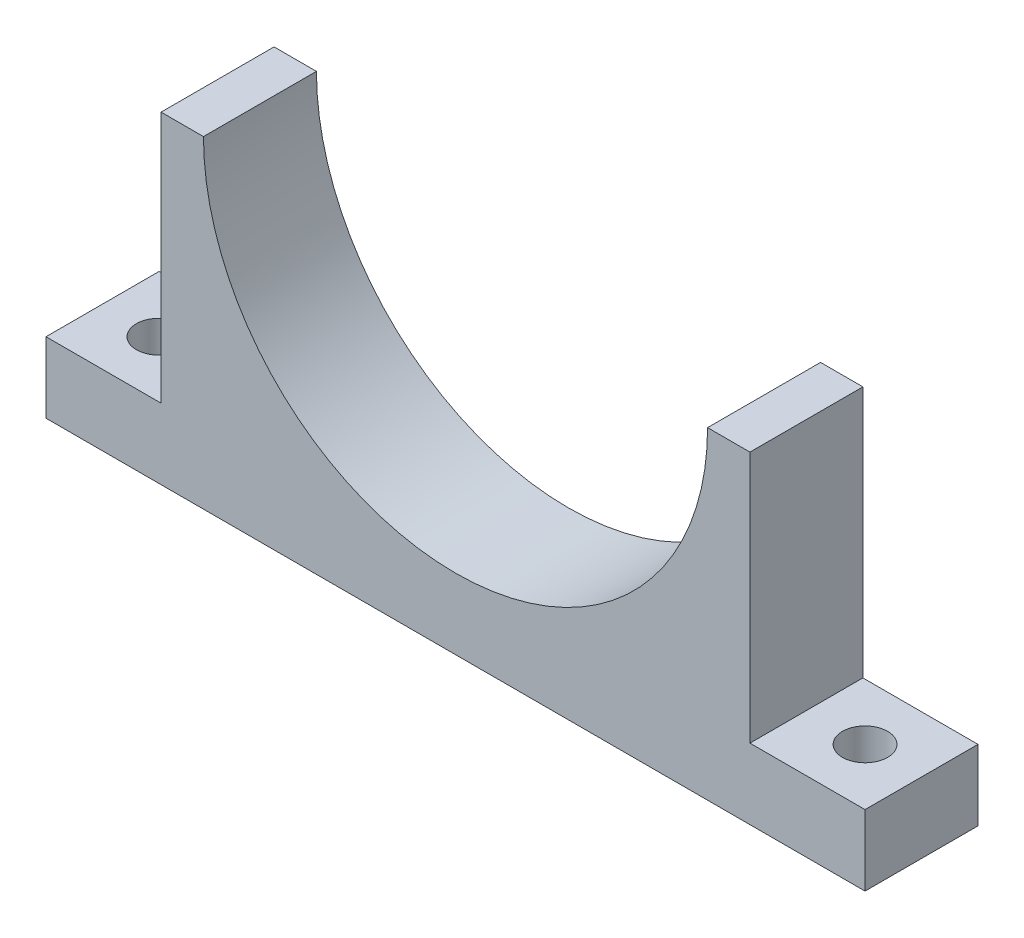
ISO-10303-21;
HEADER;
FILE_DESCRIPTION(('STEP AP214'),'2;1');
FILE_NAME('part.step','',(''),(''),'','','');
FILE_SCHEMA(('AUTOMOTIVE_DESIGN { 1 0 10303 214 1 1 1 1 }'));
ENDSEC;
DATA;
#1=APPLICATION_CONTEXT('core data for automotive mechanical design processes');
#2=APPLICATION_PROTOCOL_DEFINITION('international standard','automotive_design',2000,#1);
#3=PRODUCT_CONTEXT('',#1,'mechanical');
#4=PRODUCT('Part','Part','',(#3));
#5=PRODUCT_RELATED_PRODUCT_CATEGORY('part','',(#4));
#6=PRODUCT_DEFINITION_FORMATION('','',#4);
#7=PRODUCT_DEFINITION_CONTEXT('part definition',#1,'design');
#8=PRODUCT_DEFINITION('design','',#6,#7);
#9=PRODUCT_DEFINITION_SHAPE('','',#8);
#10=(LENGTH_UNIT() NAMED_UNIT(*) SI_UNIT(.MILLI.,.METRE.));
#11=(NAMED_UNIT(*) PLANE_ANGLE_UNIT() SI_UNIT($,.RADIAN.));
#12=(NAMED_UNIT(*) SI_UNIT($,.STERADIAN.) SOLID_ANGLE_UNIT());
#13=UNCERTAINTY_MEASURE_WITH_UNIT(LENGTH_MEASURE(1.E-05),#10,'distance_accuracy_value','');
#14=(GEOMETRIC_REPRESENTATION_CONTEXT(3) GLOBAL_UNCERTAINTY_ASSIGNED_CONTEXT((#13)) GLOBAL_UNIT_ASSIGNED_CONTEXT((#10,
#11,#12)) REPRESENTATION_CONTEXT('',''));
#15=CARTESIAN_POINT('',(0.,0.,0.));
#16=DIRECTION('',(0.,0.,1.));
#17=DIRECTION('',(1.,0.,0.));
#18=AXIS2_PLACEMENT_3D('',#15,#16,#17);
#19=CARTESIAN_POINT('',(0.,0.,8.));
#20=DIRECTION('',(0.,0.,-1.));
#21=DIRECTION('',(-1.,0.,0.));
#22=AXIS2_PLACEMENT_3D('',#19,#20,#21);
#23=CYLINDRICAL_SURFACE('',#22,17.85);
#24=CARTESIAN_POINT('',(0.,0.,0.));
#25=DIRECTION('',(0.,0.,-1.));
#26=DIRECTION('',(1.,0.,0.));
#27=AXIS2_PLACEMENT_3D('',#24,#25,#26);
#28=CIRCLE('',#27,17.85);
#29=CARTESIAN_POINT('',(17.85,0.,0.));
#30=VERTEX_POINT('',#29);
#31=CARTESIAN_POINT('',(-17.85,0.,0.));
#32=VERTEX_POINT('',#31);
#33=EDGE_CURVE('E142',#30,#32,#28,.T.);
#34=ORIENTED_EDGE('',*,*,#33,.T.);
#35=DIRECTION('',(0.,0.,-1.));
#36=VECTOR('',#35,1.);
#37=CARTESIAN_POINT('',(-17.85,0.,8.));
#38=LINE('',#37,#36);
#39=CARTESIAN_POINT('',(-17.85,0.,8.));
#40=VERTEX_POINT('',#39);
#41=EDGE_CURVE('E11',#40,#32,#38,.T.);
#42=ORIENTED_EDGE('',*,*,#41,.F.);
#43=CARTESIAN_POINT('',(0.,0.,8.));
#44=DIRECTION('',(0.,0.,-1.));
#45=DIRECTION('',(1.,0.,0.));
#46=AXIS2_PLACEMENT_3D('',#43,#44,#45);
#47=CIRCLE('',#46,17.85);
#48=CARTESIAN_POINT('',(17.85,0.,8.));
#49=VERTEX_POINT('',#48);
#50=EDGE_CURVE('E161',#49,#40,#47,.T.);
#51=ORIENTED_EDGE('',*,*,#50,.F.);
#52=DIRECTION('',(0.,0.,-1.));
#53=VECTOR('',#52,1.);
#54=CARTESIAN_POINT('',(17.85,0.,8.));
#55=LINE('',#54,#53);
#56=EDGE_CURVE('E138',#49,#30,#55,.T.);
#57=ORIENTED_EDGE('',*,*,#56,.T.);
#58=EDGE_LOOP('',(#34,#42,#51,#57));
#59=FACE_BOUND('',#58,.T.);
#60=ADVANCED_FACE('F33',(#59),#23,.F.);
#61=CARTESIAN_POINT('',(-17.85,0.,8.));
#62=DIRECTION('',(0.,-1.,0.));
#63=DIRECTION('',(1.,0.,0.));
#64=AXIS2_PLACEMENT_3D('',#61,#62,#63);
#65=PLANE('',#64);
#66=DIRECTION('',(-1.,0.,0.));
#67=VECTOR('',#66,1.);
#68=CARTESIAN_POINT('',(-17.85,0.,0.));
#69=LINE('',#68,#67);
#70=CARTESIAN_POINT('',(-20.85,0.,0.));
#71=VERTEX_POINT('',#70);
#72=EDGE_CURVE('E145',#32,#71,#69,.T.);
#73=ORIENTED_EDGE('',*,*,#72,.T.);
#74=DIRECTION('',(0.,0.,-1.));
#75=VECTOR('',#74,1.);
#76=CARTESIAN_POINT('',(-20.85,0.,8.));
#77=LINE('',#76,#75);
#78=CARTESIAN_POINT('',(-20.85,0.,8.));
#79=VERTEX_POINT('',#78);
#80=EDGE_CURVE('E42',#79,#71,#77,.T.);
#81=ORIENTED_EDGE('',*,*,#80,.F.);
#82=DIRECTION('',(-1.,0.,0.));
#83=VECTOR('',#82,1.);
#84=CARTESIAN_POINT('',(-17.85,0.,8.));
#85=LINE('',#84,#83);
#86=EDGE_CURVE('E99',#40,#79,#85,.T.);
#87=ORIENTED_EDGE('',*,*,#86,.F.);
#88=ORIENTED_EDGE('',*,*,#41,.T.);
#89=EDGE_LOOP('',(#73,#81,#87,#88));
#90=FACE_BOUND('',#89,.T.);
#91=ADVANCED_FACE('F235',(#90),#65,.F.);
#92=CARTESIAN_POINT('',(-20.85,0.,8.));
#93=DIRECTION('',(1.,0.,0.));
#94=DIRECTION('',(0.,1.,0.));
#95=AXIS2_PLACEMENT_3D('',#92,#93,#94);
#96=PLANE('',#95);
#97=DIRECTION('',(0.,-1.,0.));
#98=VECTOR('',#97,1.);
#99=CARTESIAN_POINT('',(-20.85,0.,0.));
#100=LINE('',#99,#98);
#101=CARTESIAN_POINT('',(-20.85,-17.85,0.));
#102=VERTEX_POINT('',#101);
#103=EDGE_CURVE('E148',#71,#102,#100,.T.);
#104=ORIENTED_EDGE('',*,*,#103,.T.);
#105=DIRECTION('',(0.,0.,-1.));
#106=VECTOR('',#105,1.);
#107=CARTESIAN_POINT('',(-20.85,-17.85,8.));
#108=LINE('',#107,#106);
#109=CARTESIAN_POINT('',(-20.85,-17.85,8.));
#110=VERTEX_POINT('',#109);
#111=EDGE_CURVE('E174',#110,#102,#108,.T.);
#112=ORIENTED_EDGE('',*,*,#111,.F.);
#113=DIRECTION('',(0.,-1.,0.));
#114=VECTOR('',#113,1.);
#115=CARTESIAN_POINT('',(-20.85,0.,8.));
#116=LINE('',#115,#114);
#117=EDGE_CURVE('E183',#79,#110,#116,.T.);
#118=ORIENTED_EDGE('',*,*,#117,.F.);
#119=ORIENTED_EDGE('',*,*,#80,.T.);
#120=EDGE_LOOP('',(#104,#112,#118,#119));
#121=FACE_BOUND('',#120,.T.);
#122=ADVANCED_FACE('F181',(#121),#96,.F.);
#123=CARTESIAN_POINT('',(-20.85,-17.85,8.));
#124=DIRECTION('',(0.,-1.,0.));
#125=DIRECTION('',(0.,0.,-1.));
#126=AXIS2_PLACEMENT_3D('',#123,#124,#125);
#127=PLANE('',#126);
#128=CARTESIAN_POINT('',(-25.,-17.85,4.));
#129=DIRECTION('',(0.,-1.,0.));
#130=DIRECTION('',(0.,0.,-1.));
#131=AXIS2_PLACEMENT_3D('',#128,#129,#130);
#132=CIRCLE('',#131,1.6);
#133=CARTESIAN_POINT('',(-25.,-17.85,2.4));
#134=VERTEX_POINT('',#133);
#135=EDGE_CURVE('E146',#134,#134,#132,.T.);
#136=ORIENTED_EDGE('',*,*,#135,.T.);
#137=EDGE_LOOP('',(#136));
#138=FACE_BOUND('',#137,.T.);
#139=DIRECTION('',(-1.,0.,0.));
#140=VECTOR('',#139,1.);
#141=CARTESIAN_POINT('',(-20.85,-17.85,0.));
#142=LINE('',#141,#140);
#143=CARTESIAN_POINT('',(-29.,-17.85,0.));
#144=VERTEX_POINT('',#143);
#145=EDGE_CURVE('E150',#102,#144,#142,.T.);
#146=ORIENTED_EDGE('',*,*,#145,.T.);
#147=DIRECTION('',(0.,0.,-1.));
#148=VECTOR('',#147,1.);
#149=CARTESIAN_POINT('',(-29.,-17.85,8.));
#150=LINE('',#149,#148);
#151=CARTESIAN_POINT('',(-29.,-17.85,8.));
#152=VERTEX_POINT('',#151);
#153=EDGE_CURVE('E171',#152,#144,#150,.T.);
#154=ORIENTED_EDGE('',*,*,#153,.F.);
#155=DIRECTION('',(-1.,0.,0.));
#156=VECTOR('',#155,1.);
#157=CARTESIAN_POINT('',(-20.85,-17.85,8.));
#158=LINE('',#157,#156);
#159=EDGE_CURVE('E201',#110,#152,#158,.T.);
#160=ORIENTED_EDGE('',*,*,#159,.F.);
#161=ORIENTED_EDGE('',*,*,#111,.T.);
#162=EDGE_LOOP('',(#146,#154,#160,#161));
#163=FACE_BOUND('',#162,.T.);
#164=ADVANCED_FACE('F192',(#138,#163),#127,.F.);
#165=CARTESIAN_POINT('',(-29.,-17.85,8.));
#166=DIRECTION('',(1.,0.,0.));
#167=DIRECTION('',(0.,0.,-1.));
#168=AXIS2_PLACEMENT_3D('',#165,#166,#167);
#169=PLANE('',#168);
#170=DIRECTION('',(0.,-1.,0.));
#171=VECTOR('',#170,1.);
#172=CARTESIAN_POINT('',(-29.,-17.85,0.));
#173=LINE('',#172,#171);
#174=CARTESIAN_POINT('',(-29.,-22.85,0.));
#175=VERTEX_POINT('',#174);
#176=EDGE_CURVE('E152',#144,#175,#173,.T.);
#177=ORIENTED_EDGE('',*,*,#176,.T.);
#178=DIRECTION('',(0.,0.,-1.));
#179=VECTOR('',#178,1.);
#180=CARTESIAN_POINT('',(-29.,-22.85,8.));
#181=LINE('',#180,#179);
#182=CARTESIAN_POINT('',(-29.,-22.85,8.));
#183=VERTEX_POINT('',#182);
#184=EDGE_CURVE('E168',#183,#175,#181,.T.);
#185=ORIENTED_EDGE('',*,*,#184,.F.);
#186=DIRECTION('',(0.,-1.,0.));
#187=VECTOR('',#186,1.);
#188=CARTESIAN_POINT('',(-29.,-17.85,8.));
#189=LINE('',#188,#187);
#190=EDGE_CURVE('E198',#152,#183,#189,.T.);
#191=ORIENTED_EDGE('',*,*,#190,.F.);
#192=ORIENTED_EDGE('',*,*,#153,.T.);
#193=EDGE_LOOP('',(#177,#185,#191,#192));
#194=FACE_BOUND('',#193,.T.);
#195=ADVANCED_FACE('F196',(#194),#169,.F.);
#196=CARTESIAN_POINT('',(-29.,-22.85,8.));
#197=DIRECTION('',(0.,1.,0.));
#198=DIRECTION('',(0.,0.,1.));
#199=AXIS2_PLACEMENT_3D('',#196,#197,#198);
#200=PLANE('',#199);
#201=CARTESIAN_POINT('',(-25.,-22.85,4.));
#202=DIRECTION('',(0.,-1.,0.));
#203=DIRECTION('',(0.,0.,-1.));
#204=AXIS2_PLACEMENT_3D('',#201,#202,#203);
#205=CIRCLE('',#204,1.6);
#206=CARTESIAN_POINT('',(-25.,-22.85,2.4));
#207=VERTEX_POINT('',#206);
#208=EDGE_CURVE('E214',#207,#207,#205,.T.);
#209=ORIENTED_EDGE('',*,*,#208,.F.);
#210=EDGE_LOOP('',(#209));
#211=FACE_BOUND('',#210,.T.);
#212=CARTESIAN_POINT('',(25.,-22.85,4.));
#213=DIRECTION('',(0.,-1.,0.));
#214=DIRECTION('',(0.,0.,1.));
#215=AXIS2_PLACEMENT_3D('',#212,#213,#214);
#216=CIRCLE('',#215,1.6);
#217=CARTESIAN_POINT('',(25.,-22.85,5.6));
#218=VERTEX_POINT('',#217);
#219=EDGE_CURVE('E211',#218,#218,#216,.T.);
#220=ORIENTED_EDGE('',*,*,#219,.F.);
#221=EDGE_LOOP('',(#220));
#222=FACE_BOUND('',#221,.T.);
#223=DIRECTION('',(1.,0.,0.));
#224=VECTOR('',#223,1.);
#225=CARTESIAN_POINT('',(-29.,-22.85,0.));
#226=LINE('',#225,#224);
#227=CARTESIAN_POINT('',(29.,-22.85,0.));
#228=VERTEX_POINT('',#227);
#229=EDGE_CURVE('E154',#175,#228,#226,.T.);
#230=ORIENTED_EDGE('',*,*,#229,.T.);
#231=DIRECTION('',(0.,0.,-1.));
#232=VECTOR('',#231,1.);
#233=CARTESIAN_POINT('',(29.,-22.85,8.));
#234=LINE('',#233,#232);
#235=CARTESIAN_POINT('',(29.,-22.85,8.));
#236=VERTEX_POINT('',#235);
#237=EDGE_CURVE('E165',#236,#228,#234,.T.);
#238=ORIENTED_EDGE('',*,*,#237,.F.);
#239=DIRECTION('',(1.,0.,0.));
#240=VECTOR('',#239,1.);
#241=CARTESIAN_POINT('',(-29.,-22.85,8.));
#242=LINE('',#241,#240);
#243=EDGE_CURVE('E200',#183,#236,#242,.T.);
#244=ORIENTED_EDGE('',*,*,#243,.F.);
#245=ORIENTED_EDGE('',*,*,#184,.T.);
#246=EDGE_LOOP('',(#230,#238,#244,#245));
#247=FACE_BOUND('',#246,.T.);
#248=ADVANCED_FACE('F247',(#211,#222,#247),#200,.F.);
#249=CARTESIAN_POINT('',(29.,-22.85,8.));
#250=DIRECTION('',(-1.,0.,0.));
#251=DIRECTION('',(0.,0.,1.));
#252=AXIS2_PLACEMENT_3D('',#249,#250,#251);
#253=PLANE('',#252);
#254=DIRECTION('',(0.,1.,0.));
#255=VECTOR('',#254,1.);
#256=CARTESIAN_POINT('',(29.,-22.85,0.));
#257=LINE('',#256,#255);
#258=CARTESIAN_POINT('',(29.,-17.85,0.));
#259=VERTEX_POINT('',#258);
#260=EDGE_CURVE('E156',#228,#259,#257,.T.);
#261=ORIENTED_EDGE('',*,*,#260,.T.);
#262=DIRECTION('',(0.,0.,-1.));
#263=VECTOR('',#262,1.);
#264=CARTESIAN_POINT('',(29.,-17.85,8.));
#265=LINE('',#264,#263);
#266=CARTESIAN_POINT('',(29.,-17.85,8.));
#267=VERTEX_POINT('',#266);
#268=EDGE_CURVE('E133',#267,#259,#265,.T.);
#269=ORIENTED_EDGE('',*,*,#268,.F.);
#270=DIRECTION('',(0.,1.,0.));
#271=VECTOR('',#270,1.);
#272=CARTESIAN_POINT('',(29.,-22.85,8.));
#273=LINE('',#272,#271);
#274=EDGE_CURVE('E124',#236,#267,#273,.T.);
#275=ORIENTED_EDGE('',*,*,#274,.F.);
#276=ORIENTED_EDGE('',*,*,#237,.T.);
#277=EDGE_LOOP('',(#261,#269,#275,#276));
#278=FACE_BOUND('',#277,.T.);
#279=ADVANCED_FACE('F244',(#278),#253,.F.);
#280=CARTESIAN_POINT('',(29.,-17.85,8.));
#281=DIRECTION('',(0.,-1.,0.));
#282=DIRECTION('',(0.,0.,-1.));
#283=AXIS2_PLACEMENT_3D('',#280,#281,#282);
#284=PLANE('',#283);
#285=CARTESIAN_POINT('',(25.,-17.85,4.));
#286=DIRECTION('',(0.,-1.,0.));
#287=DIRECTION('',(0.,0.,-1.));
#288=AXIS2_PLACEMENT_3D('',#285,#286,#287);
#289=CIRCLE('',#288,1.6);
#290=CARTESIAN_POINT('',(25.,-17.85,2.4));
#291=VERTEX_POINT('',#290);
#292=EDGE_CURVE('E36',#291,#291,#289,.T.);
#293=ORIENTED_EDGE('',*,*,#292,.T.);
#294=EDGE_LOOP('',(#293));
#295=FACE_BOUND('',#294,.T.);
#296=DIRECTION('',(-1.,0.,0.));
#297=VECTOR('',#296,1.);
#298=CARTESIAN_POINT('',(29.,-17.85,0.));
#299=LINE('',#298,#297);
#300=CARTESIAN_POINT('',(20.85,-17.85,0.));
#301=VERTEX_POINT('',#300);
#302=EDGE_CURVE('E132',#259,#301,#299,.T.);
#303=ORIENTED_EDGE('',*,*,#302,.T.);
#304=DIRECTION('',(0.,0.,-1.));
#305=VECTOR('',#304,1.);
#306=CARTESIAN_POINT('',(20.85,-17.85,8.));
#307=LINE('',#306,#305);
#308=CARTESIAN_POINT('',(20.85,-17.85,8.));
#309=VERTEX_POINT('',#308);
#310=EDGE_CURVE('E129',#309,#301,#307,.T.);
#311=ORIENTED_EDGE('',*,*,#310,.F.);
#312=DIRECTION('',(-1.,0.,0.));
#313=VECTOR('',#312,1.);
#314=CARTESIAN_POINT('',(29.,-17.85,8.));
#315=LINE('',#314,#313);
#316=EDGE_CURVE('E118',#267,#309,#315,.T.);
#317=ORIENTED_EDGE('',*,*,#316,.F.);
#318=ORIENTED_EDGE('',*,*,#268,.T.);
#319=EDGE_LOOP('',(#303,#311,#317,#318));
#320=FACE_BOUND('',#319,.T.);
#321=ADVANCED_FACE('F130',(#295,#320),#284,.F.);
#322=CARTESIAN_POINT('',(20.85,-17.85,8.));
#323=DIRECTION('',(-1.,0.,0.));
#324=DIRECTION('',(0.,-1.,0.));
#325=AXIS2_PLACEMENT_3D('',#322,#323,#324);
#326=PLANE('',#325);
#327=DIRECTION('',(0.,1.,0.));
#328=VECTOR('',#327,1.);
#329=CARTESIAN_POINT('',(20.85,-17.85,0.));
#330=LINE('',#329,#328);
#331=CARTESIAN_POINT('',(20.85,0.,0.));
#332=VERTEX_POINT('',#331);
#333=EDGE_CURVE('E85',#301,#332,#330,.T.);
#334=ORIENTED_EDGE('',*,*,#333,.T.);
#335=DIRECTION('',(0.,0.,-1.));
#336=VECTOR('',#335,1.);
#337=CARTESIAN_POINT('',(20.85,0.,8.));
#338=LINE('',#337,#336);
#339=CARTESIAN_POINT('',(20.85,0.,8.));
#340=VERTEX_POINT('',#339);
#341=EDGE_CURVE('E134',#340,#332,#338,.T.);
#342=ORIENTED_EDGE('',*,*,#341,.F.);
#343=DIRECTION('',(0.,1.,0.));
#344=VECTOR('',#343,1.);
#345=CARTESIAN_POINT('',(20.85,-17.85,8.));
#346=LINE('',#345,#344);
#347=EDGE_CURVE('E122',#309,#340,#346,.T.);
#348=ORIENTED_EDGE('',*,*,#347,.F.);
#349=ORIENTED_EDGE('',*,*,#310,.T.);
#350=EDGE_LOOP('',(#334,#342,#348,#349));
#351=FACE_BOUND('',#350,.T.);
#352=ADVANCED_FACE('F136',(#351),#326,.F.);
#353=CARTESIAN_POINT('',(20.85,0.,8.));
#354=DIRECTION('',(0.,-1.,0.));
#355=DIRECTION('',(1.,0.,0.));
#356=AXIS2_PLACEMENT_3D('',#353,#354,#355);
#357=PLANE('',#356);
#358=DIRECTION('',(-1.,0.,0.));
#359=VECTOR('',#358,1.);
#360=CARTESIAN_POINT('',(20.85,0.,0.));
#361=LINE('',#360,#359);
#362=EDGE_CURVE('E91',#332,#30,#361,.T.);
#363=ORIENTED_EDGE('',*,*,#362,.T.);
#364=ORIENTED_EDGE('',*,*,#56,.F.);
#365=DIRECTION('',(-1.,0.,0.));
#366=VECTOR('',#365,1.);
#367=CARTESIAN_POINT('',(20.85,0.,8.));
#368=LINE('',#367,#366);
#369=EDGE_CURVE('E50',#340,#49,#368,.T.);
#370=ORIENTED_EDGE('',*,*,#369,.F.);
#371=ORIENTED_EDGE('',*,*,#341,.T.);
#372=EDGE_LOOP('',(#363,#364,#370,#371));
#373=FACE_BOUND('',#372,.T.);
#374=ADVANCED_FACE('F295',(#373),#357,.F.);
#375=CARTESIAN_POINT('',(0.,0.,8.));
#376=DIRECTION('',(0.,0.,1.));
#377=DIRECTION('',(1.,0.,0.));
#378=AXIS2_PLACEMENT_3D('',#375,#376,#377);
#379=PLANE('',#378);
#380=ORIENTED_EDGE('',*,*,#50,.T.);
#381=ORIENTED_EDGE('',*,*,#86,.T.);
#382=ORIENTED_EDGE('',*,*,#117,.T.);
#383=ORIENTED_EDGE('',*,*,#159,.T.);
#384=ORIENTED_EDGE('',*,*,#190,.T.);
#385=ORIENTED_EDGE('',*,*,#243,.T.);
#386=ORIENTED_EDGE('',*,*,#274,.T.);
#387=ORIENTED_EDGE('',*,*,#316,.T.);
#388=ORIENTED_EDGE('',*,*,#347,.T.);
#389=ORIENTED_EDGE('',*,*,#369,.T.);
#390=EDGE_LOOP('',(#380,#381,#382,#383,#384,#385,#386,#387,#388,#389));
#391=FACE_BOUND('',#390,.T.);
#392=ADVANCED_FACE('F120',(#391),#379,.T.);
#393=CARTESIAN_POINT('',(0.,0.,0.));
#394=DIRECTION('',(0.,0.,1.));
#395=DIRECTION('',(1.,0.,0.));
#396=AXIS2_PLACEMENT_3D('',#393,#394,#395);
#397=PLANE('',#396);
#398=ORIENTED_EDGE('',*,*,#33,.F.);
#399=ORIENTED_EDGE('',*,*,#362,.F.);
#400=ORIENTED_EDGE('',*,*,#333,.F.);
#401=ORIENTED_EDGE('',*,*,#302,.F.);
#402=ORIENTED_EDGE('',*,*,#260,.F.);
#403=ORIENTED_EDGE('',*,*,#229,.F.);
#404=ORIENTED_EDGE('',*,*,#176,.F.);
#405=ORIENTED_EDGE('',*,*,#145,.F.);
#406=ORIENTED_EDGE('',*,*,#103,.F.);
#407=ORIENTED_EDGE('',*,*,#72,.F.);
#408=EDGE_LOOP('',(#398,#399,#400,#401,#402,#403,#404,#405,#406,#407));
#409=FACE_BOUND('',#408,.T.);
#410=ADVANCED_FACE('F187',(#409),#397,.F.);
#411=CARTESIAN_POINT('',(25.,-14.85,4.));
#412=DIRECTION('',(0.,-1.,0.));
#413=DIRECTION('',(0.,0.,-1.));
#414=AXIS2_PLACEMENT_3D('',#411,#412,#413);
#415=CYLINDRICAL_SURFACE('',#414,1.6);
#416=ORIENTED_EDGE('',*,*,#219,.T.);
#417=EDGE_LOOP('',(#416));
#418=FACE_BOUND('',#417,.T.);
#419=ORIENTED_EDGE('',*,*,#292,.F.);
#420=EDGE_LOOP('',(#419));
#421=FACE_BOUND('',#420,.T.);
#422=ADVANCED_FACE('F222',(#418,#421),#415,.F.);
#423=CARTESIAN_POINT('',(-25.,-14.85,4.));
#424=DIRECTION('',(0.,-1.,0.));
#425=DIRECTION('',(0.,0.,-1.));
#426=AXIS2_PLACEMENT_3D('',#423,#424,#425);
#427=CYLINDRICAL_SURFACE('',#426,1.6);
#428=ORIENTED_EDGE('',*,*,#208,.T.);
#429=EDGE_LOOP('',(#428));
#430=FACE_BOUND('',#429,.T.);
#431=ORIENTED_EDGE('',*,*,#135,.F.);
#432=EDGE_LOOP('',(#431));
#433=FACE_BOUND('',#432,.T.);
#434=ADVANCED_FACE('F224',(#430,#433),#427,.F.);
#435=CLOSED_SHELL('',(#60,#91,#122,#164,#195,#248,#279,#321,#352,#374,#392,#410,#422,#434));
#436=MANIFOLD_SOLID_BREP('B2',#435);
#437=ADVANCED_BREP_SHAPE_REPRESENTATION('',(#18,#436),#14);
#438=SHAPE_DEFINITION_REPRESENTATION(#9,#437);
ENDSEC;
END-ISO-10303-21;
